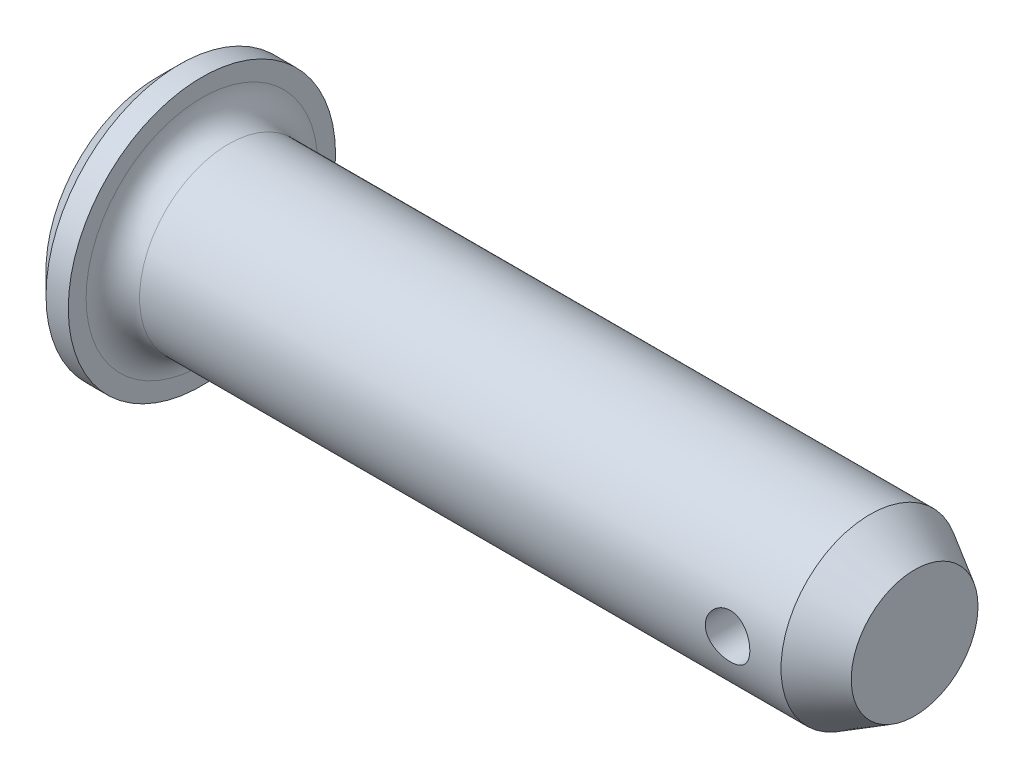
ISO-10303-21;
HEADER;
FILE_DESCRIPTION(('STEP AP214'),'2;1');
FILE_NAME('part.step','',(''),(''),'','','');
FILE_SCHEMA(('AUTOMOTIVE_DESIGN { 1 0 10303 214 1 1 1 1 }'));
ENDSEC;
DATA;
#1=APPLICATION_CONTEXT('core data for automotive mechanical design processes');
#2=APPLICATION_PROTOCOL_DEFINITION('international standard','automotive_design',2000,#1);
#3=PRODUCT_CONTEXT('',#1,'mechanical');
#4=PRODUCT('Part','Part','',(#3));
#5=PRODUCT_RELATED_PRODUCT_CATEGORY('part','',(#4));
#6=PRODUCT_DEFINITION_FORMATION('','',#4);
#7=PRODUCT_DEFINITION_CONTEXT('part definition',#1,'design');
#8=PRODUCT_DEFINITION('design','',#6,#7);
#9=PRODUCT_DEFINITION_SHAPE('','',#8);
#10=(LENGTH_UNIT() NAMED_UNIT(*) SI_UNIT(.MILLI.,.METRE.));
#11=(NAMED_UNIT(*) PLANE_ANGLE_UNIT() SI_UNIT($,.RADIAN.));
#12=(NAMED_UNIT(*) SI_UNIT($,.STERADIAN.) SOLID_ANGLE_UNIT());
#13=UNCERTAINTY_MEASURE_WITH_UNIT(LENGTH_MEASURE(1.E-05),#10,'distance_accuracy_value','');
#14=(GEOMETRIC_REPRESENTATION_CONTEXT(3) GLOBAL_UNCERTAINTY_ASSIGNED_CONTEXT((#13)) GLOBAL_UNIT_ASSIGNED_CONTEXT((#10,
#11,#12)) REPRESENTATION_CONTEXT('',''));
#15=CARTESIAN_POINT('',(0.,0.,0.));
#16=DIRECTION('',(0.,0.,1.));
#17=DIRECTION('',(1.,0.,0.));
#18=AXIS2_PLACEMENT_3D('',#15,#16,#17);
#19=CARTESIAN_POINT('',(0.,0.,0.));
#20=DIRECTION('',(-1.,0.,0.));
#21=DIRECTION('',(0.,0.,1.));
#22=AXIS2_PLACEMENT_3D('',#19,#20,#21);
#23=PLANE('',#22);
#24=CARTESIAN_POINT('',(0.,0.,0.));
#25=DIRECTION('',(1.,0.,0.));
#26=DIRECTION('',(0.,0.,-1.));
#27=AXIS2_PLACEMENT_3D('',#24,#25,#26);
#28=CIRCLE('',#27,2.5);
#29=CARTESIAN_POINT('',(0.,0.,-2.5));
#30=VERTEX_POINT('',#29);
#31=EDGE_CURVE('E61',#30,#30,#28,.T.);
#32=ORIENTED_EDGE('',*,*,#31,.F.);
#33=EDGE_LOOP('',(#32));
#34=FACE_BOUND('',#33,.T.);
#35=ADVANCED_FACE('F38',(#34),#23,.T.);
#36=CARTESIAN_POINT('',(0.5,0.,0.));
#37=DIRECTION('',(1.,0.,0.));
#38=DIRECTION('',(0.,0.,-1.));
#39=AXIS2_PLACEMENT_3D('',#36,#37,#38);
#40=CONICAL_SURFACE('',#39,3.,0.785398163397448);
#41=ORIENTED_EDGE('',*,*,#31,.T.);
#42=EDGE_LOOP('',(#41));
#43=FACE_BOUND('',#42,.T.);
#44=CARTESIAN_POINT('',(0.5,0.,0.));
#45=DIRECTION('',(1.,0.,0.));
#46=DIRECTION('',(0.,0.,-1.));
#47=AXIS2_PLACEMENT_3D('',#44,#45,#46);
#48=CIRCLE('',#47,3.);
#49=CARTESIAN_POINT('',(0.5,0.,-3.));
#50=VERTEX_POINT('',#49);
#51=EDGE_CURVE('E126',#50,#50,#48,.T.);
#52=ORIENTED_EDGE('',*,*,#51,.F.);
#53=EDGE_LOOP('',(#52));
#54=FACE_BOUND('',#53,.T.);
#55=ADVANCED_FACE('F93',(#43,#54),#40,.T.);
#56=CARTESIAN_POINT('',(0.,0.,0.));
#57=DIRECTION('',(1.,0.,0.));
#58=DIRECTION('',(0.,0.,-1.));
#59=AXIS2_PLACEMENT_3D('',#56,#57,#58);
#60=CYLINDRICAL_SURFACE('',#59,3.);
#61=ORIENTED_EDGE('',*,*,#51,.T.);
#62=EDGE_LOOP('',(#61));
#63=FACE_BOUND('',#62,.T.);
#64=CARTESIAN_POINT('',(1.,0.,0.));
#65=DIRECTION('',(1.,0.,0.));
#66=DIRECTION('',(0.,0.,-1.));
#67=AXIS2_PLACEMENT_3D('',#64,#65,#66);
#68=CIRCLE('',#67,3.);
#69=CARTESIAN_POINT('',(1.,0.,-3.));
#70=VERTEX_POINT('',#69);
#71=EDGE_CURVE('E70',#70,#70,#68,.T.);
#72=ORIENTED_EDGE('',*,*,#71,.F.);
#73=EDGE_LOOP('',(#72));
#74=FACE_BOUND('',#73,.T.);
#75=ADVANCED_FACE('F99',(#63,#74),#60,.T.);
#76=CARTESIAN_POINT('',(1.,3.,0.));
#77=DIRECTION('',(1.,0.,0.));
#78=DIRECTION('',(0.,0.,-1.));
#79=AXIS2_PLACEMENT_3D('',#76,#77,#78);
#80=PLANE('',#79);
#81=CARTESIAN_POINT('',(1.,0.,0.));
#82=DIRECTION('',(1.,0.,0.));
#83=DIRECTION('',(0.,0.,-1.));
#84=AXIS2_PLACEMENT_3D('',#81,#82,#83);
#85=CIRCLE('',#84,2.6);
#86=CARTESIAN_POINT('',(1.,0.,-2.6));
#87=VERTEX_POINT('',#86);
#88=EDGE_CURVE('E50',#87,#87,#85,.F.);
#89=ORIENTED_EDGE('',*,*,#88,.T.);
#90=EDGE_LOOP('',(#89));
#91=FACE_BOUND('',#90,.T.);
#92=ORIENTED_EDGE('',*,*,#71,.T.);
#93=EDGE_LOOP('',(#92));
#94=FACE_BOUND('',#93,.T.);
#95=ADVANCED_FACE('F91',(#91,#94),#80,.T.);
#96=CARTESIAN_POINT('',(0.,0.,0.));
#97=DIRECTION('',(1.,0.,0.));
#98=DIRECTION('',(0.,0.,-1.));
#99=AXIS2_PLACEMENT_3D('',#96,#97,#98);
#100=CYLINDRICAL_SURFACE('',#99,2.);
#101=CARTESIAN_POINT('',(16.,0.,0.));
#102=DIRECTION('',(1.,0.,0.));
#103=DIRECTION('',(0.,0.,-1.));
#104=AXIS2_PLACEMENT_3D('',#101,#102,#103);
#105=CIRCLE('',#104,2.);
#106=CARTESIAN_POINT('',(16.,0.,-2.));
#107=VERTEX_POINT('',#106);
#108=EDGE_CURVE('E10',#107,#107,#105,.F.);
#109=ORIENTED_EDGE('',*,*,#108,.T.);
#110=EDGE_LOOP('',(#109));
#111=FACE_BOUND('',#110,.T.);
#112=CARTESIAN_POINT('',(1.6,0.,0.));
#113=DIRECTION('',(1.,0.,0.));
#114=DIRECTION('',(0.,0.,-1.));
#115=AXIS2_PLACEMENT_3D('',#112,#113,#114);
#116=CIRCLE('',#115,2.);
#117=CARTESIAN_POINT('',(1.6,0.,-2.));
#118=VERTEX_POINT('',#117);
#119=EDGE_CURVE('E56',#118,#118,#116,.T.);
#120=ORIENTED_EDGE('',*,*,#119,.T.);
#121=EDGE_LOOP('',(#120));
#122=FACE_BOUND('',#121,.T.);
#123=CARTESIAN_POINT('',(14.3,0.,-2.));
#124=CARTESIAN_POINT('',(14.3000007752461,0.0276253628899104,-1.99999953289338));
#125=CARTESIAN_POINT('',(14.3022971835913,0.0552593859435878,-1.99942192710609));
#126=CARTESIAN_POINT('',(14.311408383769,0.109735441256844,-1.99717371276631));
#127=CARTESIAN_POINT('',(14.3182257365126,0.13657701562358,-1.99550248473323));
#128=CARTESIAN_POINT('',(14.3361464178207,0.188673624060859,-1.99125208777347));
#129=CARTESIAN_POINT('',(14.3472445995718,0.213930521143335,-1.98867400947362));
#130=CARTESIAN_POINT('',(14.3733937966816,0.262224043968142,-1.98288447935864));
#131=CARTESIAN_POINT('',(14.388444945373,0.28526059478292,-1.97967300618017));
#132=CARTESIAN_POINT('',(14.4224002632181,0.328933975766973,-1.97289137863934));
#133=CARTESIAN_POINT('',(14.4413705249864,0.34951856335369,-1.96931569049511));
#134=CARTESIAN_POINT('',(14.482484068303,0.387249642401101,-1.96224540039177));
#135=CARTESIAN_POINT('',(14.5046277076488,0.404395745649712,-1.95875080762783));
#136=CARTESIAN_POINT('',(14.5518650755792,0.435008847599678,-1.9521825856657));
#137=CARTESIAN_POINT('',(14.5769977436035,0.448417405308453,-1.94911598156868));
#138=CARTESIAN_POINT('',(14.6292494705528,0.470798969516843,-1.94383164937408));
#139=CARTESIAN_POINT('',(14.6563682111086,0.479772685146445,-1.94161378557596));
#140=CARTESIAN_POINT('',(14.7112478327342,0.492851612268098,-1.93833492239184));
#141=CARTESIAN_POINT('',(14.7389849653499,0.497050756111114,-1.93725163691809));
#142=CARTESIAN_POINT('',(14.7947895230047,0.500753925022618,-1.9362978751258));
#143=CARTESIAN_POINT('',(14.8228568935662,0.500258713939327,-1.93642720149548));
#144=CARTESIAN_POINT('',(14.8778052692482,0.494662174879761,-1.93786401832206));
#145=CARTESIAN_POINT('',(14.9046985404884,0.489672780063508,-1.93914287667293));
#146=CARTESIAN_POINT('',(14.9572536836371,0.475408062301036,-1.94268903225495));
#147=CARTESIAN_POINT('',(14.9829154676763,0.466132434023142,-1.94495639990232));
#148=CARTESIAN_POINT('',(15.0325793387507,0.443463159312385,-1.95025037968062));
#149=CARTESIAN_POINT('',(15.0565620572632,0.430028889077638,-1.95328442489807));
#150=CARTESIAN_POINT('',(15.1019729032523,0.399452092004985,-1.95976570282129));
#151=CARTESIAN_POINT('',(15.1234005826891,0.382308916269613,-1.96321300778245));
#152=CARTESIAN_POINT('',(15.1637345385648,0.344221141560406,-1.9702529351326));
#153=CARTESIAN_POINT('',(15.1825514966871,0.323182086055287,-1.97384689825991));
#154=CARTESIAN_POINT('',(15.2164070808213,0.278203972501234,-1.98068655192929));
#155=CARTESIAN_POINT('',(15.2314455914212,0.254264825902648,-1.98393223183139));
#156=CARTESIAN_POINT('',(15.2573501954081,0.204038629560464,-1.98972577364728));
#157=CARTESIAN_POINT('',(15.2682017800848,0.177743797736208,-1.99227120042575));
#158=CARTESIAN_POINT('',(15.2853057685699,0.123625336047627,-1.99635972330473));
#159=CARTESIAN_POINT('',(15.2915590521394,0.0958019997168279,-1.99790301113094));
#160=CARTESIAN_POINT('',(15.299152521853,0.0401799901300084,-1.99978499757125));
#161=CARTESIAN_POINT('',(15.3006143420251,0.0123989066627361,-2.00015351169426));
#162=CARTESIAN_POINT('',(15.2989169993148,-0.0430109582671696,-1.9997293493815));
#163=CARTESIAN_POINT('',(15.2957582524003,-0.0706397532148652,-1.99893677747282));
#164=CARTESIAN_POINT('',(15.2850096972029,-0.124538089592164,-1.99629860375786));
#165=CARTESIAN_POINT('',(15.2774862455077,-0.150821706322918,-1.99446878061937));
#166=CARTESIAN_POINT('',(15.2582976386572,-0.201752430817504,-1.98996235544711));
#167=CARTESIAN_POINT('',(15.246632065229,-0.226399373010878,-1.98728566789964));
#168=CARTESIAN_POINT('',(15.2192546237084,-0.273841044809949,-1.98131102642104));
#169=CARTESIAN_POINT('',(15.2034746292011,-0.29659514727861,-1.97800289122311));
#170=CARTESIAN_POINT('',(15.1684033637344,-0.339175537881082,-1.97114836395807));
#171=CARTESIAN_POINT('',(15.1491114867944,-0.35900131965767,-1.96760193083902));
#172=CARTESIAN_POINT('',(15.1069993463852,-0.39566352269091,-1.96056318986924));
#173=CARTESIAN_POINT('',(15.0841040989992,-0.412414622540678,-1.95707434729094));
#174=CARTESIAN_POINT('',(15.0357557885114,-0.4418369196709,-1.95064292792413));
#175=CARTESIAN_POINT('',(15.0103028390134,-0.454508298052646,-1.94770032689009));
#176=CARTESIAN_POINT('',(14.957698092529,-0.475317140203098,-1.94272698244888));
#177=CARTESIAN_POINT('',(14.9305574572187,-0.483481465551356,-1.94069085097302));
#178=CARTESIAN_POINT('',(14.8752301207036,-0.495115219984594,-1.93775581363395));
#179=CARTESIAN_POINT('',(14.8470436496558,-0.49858567582622,-1.93685665906645));
#180=CARTESIAN_POINT('',(14.7912929920483,-0.500679530111332,-1.93631633734652));
#181=CARTESIAN_POINT('',(14.7637341882918,-0.49943929926004,-1.93663977576088));
#182=CARTESIAN_POINT('',(14.7092320371107,-0.492459092770956,-1.93842636335948));
#183=CARTESIAN_POINT('',(14.6822886773288,-0.486719207562257,-1.93988948963952));
#184=CARTESIAN_POINT('',(14.6299305136449,-0.470977106480932,-1.94377086894241));
#185=CARTESIAN_POINT('',(14.6045075649199,-0.461000468226793,-1.94618338412103));
#186=CARTESIAN_POINT('',(14.5556782057621,-0.437088304535025,-1.95169251908276));
#187=CARTESIAN_POINT('',(14.5322720756044,-0.423152230011397,-1.95478923373591));
#188=CARTESIAN_POINT('',(14.4874817903327,-0.391289249545713,-1.96141878087837));
#189=CARTESIAN_POINT('',(14.4661663088587,-0.373267720970753,-1.96496088277252));
#190=CARTESIAN_POINT('',(14.4268176517349,-0.333929790396579,-1.97202675748762));
#191=CARTESIAN_POINT('',(14.408785256629,-0.312612607087049,-1.97555052575687));
#192=CARTESIAN_POINT('',(14.3761962304785,-0.266822528900864,-1.98225885215888));
#193=CARTESIAN_POINT('',(14.3617084621095,-0.242299474105463,-1.98543611121956));
#194=CARTESIAN_POINT('',(14.3370841790198,-0.191088686503492,-1.99101641658373));
#195=CARTESIAN_POINT('',(14.3269445464505,-0.16440252114558,-1.99342001733261));
#196=CARTESIAN_POINT('',(14.3128093898901,-0.114803417747824,-1.99682686521847));
#197=CARTESIAN_POINT('',(14.3080162523155,-0.0921267236360228,-1.9980086168423));
#198=CARTESIAN_POINT('',(14.301611352126,-0.0463020238454277,-1.99959535077316));
#199=CARTESIAN_POINT('',(14.2999993502316,-0.0231540537475387,-2.00000039150298));
#200=CARTESIAN_POINT('',(14.3,0.,-2.));
#201=B_SPLINE_CURVE_WITH_KNOTS('',3,(#123,#124,#125,#126,#127,#128,#129,#130,#131,#132,#133,
#134,#135,#136,#137,#138,#139,#140,#141,#142,#143,#144,#145,#146,#147,#148,#149,#150,#151,#152,
#153,#154,#155,#156,#157,#158,#159,#160,#161,#162,#163,#164,#165,#166,#167,#168,#169,#170,#171,
#172,#173,#174,#175,#176,#177,#178,#179,#180,#181,#182,#183,#184,#185,#186,#187,#188,#189,#190,
#191,#192,#193,#194,#195,#196,#197,#198,#199,#200),.UNSPECIFIED.,.T.,.F.,(4,2,2,2,2,2,2,2,2,2,2,
2,2,2,2,2,2,2,2,2,2,2,2,2,2,2,2,2,2,2,2,2,2,2,2,2,2,2,4),(0.,0.08279123749063,0.165629412587966,
0.248368300762035,0.331109980056443,0.415381451457129,0.499662431933539,0.585195491819357,
0.670714870564561,0.75452098366477,0.838313460375658,0.920074990023394,1.0018423448868,
1.08443509291293,1.16704230278721,1.25200500323007,1.33697029852749,1.42222743003038,
1.50746824562881,1.59052769649759,1.67357967037581,1.75540091504679,1.83723042440764,
1.92051195855117,2.0038078766934,2.08914836401492,2.17448506249836,2.25930751538012,
2.34411141084136,2.42647926799538,2.50884546985345,2.59072133519816,2.67260856045634,
2.75663192136637,2.84067523256806,2.92624061833196,3.01174454607117,3.08114080980717,
3.1505318534768),.UNSPECIFIED.);
#202=CARTESIAN_POINT('',(14.3,0.,-2.));
#203=VERTEX_POINT('',#202);
#204=EDGE_CURVE('E62',#203,#203,#201,.T.);
#205=ORIENTED_EDGE('',*,*,#204,.F.);
#206=EDGE_LOOP('',(#205));
#207=FACE_BOUND('',#206,.T.);
#208=CARTESIAN_POINT('',(15.3,0.,2.));
#209=CARTESIAN_POINT('',(15.299999224754,0.0276253628899103,1.99999953289338));
#210=CARTESIAN_POINT('',(15.2977028164087,0.0552593859435876,1.99942192710609));
#211=CARTESIAN_POINT('',(15.288591616231,0.109735441256844,1.99717371276631));
#212=CARTESIAN_POINT('',(15.2817742634874,0.13657701562358,1.99550248473323));
#213=CARTESIAN_POINT('',(15.2638535821793,0.188673624060859,1.99125208777347));
#214=CARTESIAN_POINT('',(15.2527554004282,0.213930521143335,1.98867400947362));
#215=CARTESIAN_POINT('',(15.2266062033184,0.262224043968142,1.98288447935864));
#216=CARTESIAN_POINT('',(15.211555054627,0.28526059478292,1.97967300618017));
#217=CARTESIAN_POINT('',(15.1775997367819,0.328933975766973,1.97289137863934));
#218=CARTESIAN_POINT('',(15.1586294750136,0.34951856335369,1.96931569049511));
#219=CARTESIAN_POINT('',(15.117515931697,0.387249642401101,1.96224540039177));
#220=CARTESIAN_POINT('',(15.0953722923512,0.404395745649712,1.95875080762783));
#221=CARTESIAN_POINT('',(15.0481349244209,0.435008847599677,1.9521825856657));
#222=CARTESIAN_POINT('',(15.0230022563965,0.448417405308452,1.94911598156868));
#223=CARTESIAN_POINT('',(14.9707505294472,0.470798969516843,1.94383164937408));
#224=CARTESIAN_POINT('',(14.9436317888914,0.479772685146445,1.94161378557596));
#225=CARTESIAN_POINT('',(14.8887521672659,0.492851612268097,1.93833492239184));
#226=CARTESIAN_POINT('',(14.8610150346501,0.497050756111113,1.93725163691809));
#227=CARTESIAN_POINT('',(14.8052104769953,0.500753925022618,1.9362978751258));
#228=CARTESIAN_POINT('',(14.7771431064338,0.500258713939327,1.93642720149548));
#229=CARTESIAN_POINT('',(14.7221947307518,0.494662174879761,1.93786401832206));
#230=CARTESIAN_POINT('',(14.6953014595116,0.489672780063508,1.93914287667293));
#231=CARTESIAN_POINT('',(14.6427463163629,0.475408062301036,1.94268903225495));
#232=CARTESIAN_POINT('',(14.6170845323237,0.466132434023142,1.94495639990232));
#233=CARTESIAN_POINT('',(14.5674206612493,0.443463159312386,1.95025037968062));
#234=CARTESIAN_POINT('',(14.5434379427368,0.430028889077638,1.95328442489807));
#235=CARTESIAN_POINT('',(14.4980270967477,0.399452092004986,1.95976570282129));
#236=CARTESIAN_POINT('',(14.4765994173109,0.382308916269614,1.96321300778245));
#237=CARTESIAN_POINT('',(14.4362654614352,0.344221141560406,1.9702529351326));
#238=CARTESIAN_POINT('',(14.4174485033129,0.323182086055287,1.97384689825991));
#239=CARTESIAN_POINT('',(14.3835929191787,0.278203972501234,1.98068655192929));
#240=CARTESIAN_POINT('',(14.3685544085788,0.254264825902648,1.98393223183139));
#241=CARTESIAN_POINT('',(14.3426498045919,0.204038629560464,1.98972577364728));
#242=CARTESIAN_POINT('',(14.3317982199152,0.177743797736208,1.99227120042575));
#243=CARTESIAN_POINT('',(14.3146942314301,0.123625336047627,1.99635972330473));
#244=CARTESIAN_POINT('',(14.3084409478606,0.0958019997168279,1.99790301113094));
#245=CARTESIAN_POINT('',(14.3008474781471,0.0401799901300084,1.99978499757125));
#246=CARTESIAN_POINT('',(14.2993856579749,0.0123989066627361,2.00015351169426));
#247=CARTESIAN_POINT('',(14.3010830006852,-0.0430109582671696,1.9997293493815));
#248=CARTESIAN_POINT('',(14.3042417475997,-0.0706397532148652,1.99893677747282));
#249=CARTESIAN_POINT('',(14.3149903027971,-0.124538089592164,1.99629860375786));
#250=CARTESIAN_POINT('',(14.3225137544923,-0.150821706322918,1.99446878061937));
#251=CARTESIAN_POINT('',(14.3417023613428,-0.201752430817504,1.98996235544711));
#252=CARTESIAN_POINT('',(14.3533679347711,-0.226399373010878,1.98728566789964));
#253=CARTESIAN_POINT('',(14.3807453762916,-0.273841044809949,1.98131102642104));
#254=CARTESIAN_POINT('',(14.3965253707989,-0.29659514727861,1.97800289122311));
#255=CARTESIAN_POINT('',(14.4315966362657,-0.339175537881082,1.97114836395807));
#256=CARTESIAN_POINT('',(14.4508885132056,-0.35900131965767,1.96760193083902));
#257=CARTESIAN_POINT('',(14.4930006536148,-0.39566352269091,1.96056318986924));
#258=CARTESIAN_POINT('',(14.5158959010008,-0.412414622540678,1.95707434729094));
#259=CARTESIAN_POINT('',(14.5642442114886,-0.4418369196709,1.95064292792413));
#260=CARTESIAN_POINT('',(14.5896971609866,-0.454508298052646,1.94770032689009));
#261=CARTESIAN_POINT('',(14.642301907471,-0.475317140203098,1.94272698244888));
#262=CARTESIAN_POINT('',(14.6694425427813,-0.483481465551356,1.94069085097302));
#263=CARTESIAN_POINT('',(14.7247698792964,-0.495115219984594,1.93775581363395));
#264=CARTESIAN_POINT('',(14.7529563503442,-0.49858567582622,1.93685665906645));
#265=CARTESIAN_POINT('',(14.8087070079517,-0.500679530111332,1.93631633734652));
#266=CARTESIAN_POINT('',(14.8362658117082,-0.49943929926004,1.93663977576088));
#267=CARTESIAN_POINT('',(14.8907679628893,-0.492459092770956,1.93842636335948));
#268=CARTESIAN_POINT('',(14.9177113226712,-0.486719207562257,1.93988948963952));
#269=CARTESIAN_POINT('',(14.9700694863551,-0.470977106480932,1.94377086894241));
#270=CARTESIAN_POINT('',(14.9954924350801,-0.461000468226793,1.94618338412103));
#271=CARTESIAN_POINT('',(15.0443217942379,-0.437088304535025,1.95169251908276));
#272=CARTESIAN_POINT('',(15.0677279243956,-0.423152230011397,1.95478923373591));
#273=CARTESIAN_POINT('',(15.1125182096673,-0.391289249545713,1.96141878087837));
#274=CARTESIAN_POINT('',(15.1338336911413,-0.373267720970753,1.96496088277252));
#275=CARTESIAN_POINT('',(15.1731823482651,-0.333929790396579,1.97202675748762));
#276=CARTESIAN_POINT('',(15.191214743371,-0.312612607087049,1.97555052575687));
#277=CARTESIAN_POINT('',(15.2238037695215,-0.266822528900864,1.98225885215888));
#278=CARTESIAN_POINT('',(15.2382915378905,-0.242299474105463,1.98543611121956));
#279=CARTESIAN_POINT('',(15.2629158209802,-0.191088686503492,1.99101641658373));
#280=CARTESIAN_POINT('',(15.2730554535495,-0.16440252114558,1.99342001733261));
#281=CARTESIAN_POINT('',(15.2871906101099,-0.114803417747824,1.99682686521847));
#282=CARTESIAN_POINT('',(15.2919837476845,-0.0921267236360228,1.9980086168423));
#283=CARTESIAN_POINT('',(15.298388647874,-0.0463020238454277,1.99959535077316));
#284=CARTESIAN_POINT('',(15.3000006497684,-0.0231540537475387,2.00000039150298));
#285=CARTESIAN_POINT('',(15.3,0.,2.));
#286=B_SPLINE_CURVE_WITH_KNOTS('',3,(#208,#209,#210,#211,#212,#213,#214,#215,#216,#217,#218,
#219,#220,#221,#222,#223,#224,#225,#226,#227,#228,#229,#230,#231,#232,#233,#234,#235,#236,#237,
#238,#239,#240,#241,#242,#243,#244,#245,#246,#247,#248,#249,#250,#251,#252,#253,#254,#255,#256,
#257,#258,#259,#260,#261,#262,#263,#264,#265,#266,#267,#268,#269,#270,#271,#272,#273,#274,#275,
#276,#277,#278,#279,#280,#281,#282,#283,#284,#285),.UNSPECIFIED.,.T.,.F.,(4,2,2,2,2,2,2,2,2,2,2,
2,2,2,2,2,2,2,2,2,2,2,2,2,2,2,2,2,2,2,2,2,2,2,2,2,2,2,4),(0.,0.0827912374906297,
0.165629412587966,0.248368300762035,0.331109980056443,0.415381451457129,0.499662431933539,
0.585195491819355,0.670714870564561,0.754520983664769,0.838313460375658,0.920074990023394,
1.0018423448868,1.08443509291293,1.16704230278721,1.25200500323007,1.33697029852749,
1.42222743003038,1.50746824562881,1.59052769649759,1.67357967037581,1.75540091504679,
1.83723042440764,1.92051195855117,2.0038078766934,2.08914836401492,2.17448506249836,
2.25930751538012,2.34411141084136,2.42647926799538,2.50884546985345,2.59072133519816,
2.67260856045634,2.75663192136637,2.84067523256806,2.92624061833196,3.01174454607117,
3.08114080980717,3.1505318534768),.UNSPECIFIED.);
#287=CARTESIAN_POINT('',(15.3,0.,2.));
#288=VERTEX_POINT('',#287);
#289=EDGE_CURVE('E71',#288,#288,#286,.T.);
#290=ORIENTED_EDGE('',*,*,#289,.F.);
#291=EDGE_LOOP('',(#290));
#292=FACE_BOUND('',#291,.T.);
#293=ADVANCED_FACE('F76',(#111,#122,#207,#292),#100,.T.);
#294=CARTESIAN_POINT('',(17.,2.,0.));
#295=DIRECTION('',(1.,0.,0.));
#296=DIRECTION('',(0.,0.,-1.));
#297=AXIS2_PLACEMENT_3D('',#294,#295,#296);
#298=PLANE('',#297);
#299=CARTESIAN_POINT('',(17.,0.,0.));
#300=DIRECTION('',(1.,0.,0.));
#301=DIRECTION('',(0.,0.,-1.));
#302=AXIS2_PLACEMENT_3D('',#299,#300,#301);
#303=CIRCLE('',#302,1.42264973081038);
#304=CARTESIAN_POINT('',(17.,0.,-1.42264973081038));
#305=VERTEX_POINT('',#304);
#306=EDGE_CURVE('E45',#305,#305,#303,.T.);
#307=ORIENTED_EDGE('',*,*,#306,.T.);
#308=EDGE_LOOP('',(#307));
#309=FACE_BOUND('',#308,.T.);
#310=ADVANCED_FACE('F84',(#309),#298,.T.);
#311=CARTESIAN_POINT('',(14.8,0.,-3.));
#312=DIRECTION('',(0.,0.,1.));
#313=DIRECTION('',(1.,0.,0.));
#314=AXIS2_PLACEMENT_3D('',#311,#312,#313);
#315=CYLINDRICAL_SURFACE('',#314,0.500000000000001);
#316=ORIENTED_EDGE('',*,*,#204,.T.);
#317=EDGE_LOOP('',(#316));
#318=FACE_BOUND('',#317,.T.);
#319=ORIENTED_EDGE('',*,*,#289,.T.);
#320=EDGE_LOOP('',(#319));
#321=FACE_BOUND('',#320,.T.);
#322=ADVANCED_FACE('F80',(#318,#321),#315,.F.);
#323=CARTESIAN_POINT('',(1.6,0.,0.));
#324=DIRECTION('',(1.,0.,0.));
#325=DIRECTION('',(0.,0.,-1.));
#326=AXIS2_PLACEMENT_3D('',#323,#324,#325);
#327=TOROIDAL_SURFACE('',#326,2.6,0.6);
#328=ORIENTED_EDGE('',*,*,#88,.F.);
#329=EDGE_LOOP('',(#328));
#330=FACE_BOUND('',#329,.T.);
#331=ORIENTED_EDGE('',*,*,#119,.F.);
#332=EDGE_LOOP('',(#331));
#333=FACE_BOUND('',#332,.T.);
#334=ADVANCED_FACE('F83',(#330,#333),#327,.F.);
#335=CARTESIAN_POINT('',(17.,0.,0.));
#336=DIRECTION('',(-1.,0.,0.));
#337=DIRECTION('',(0.,0.,1.));
#338=AXIS2_PLACEMENT_3D('',#335,#336,#337);
#339=CONICAL_SURFACE('',#338,1.42264973081038,0.523598775598296);
#340=ORIENTED_EDGE('',*,*,#108,.F.);
#341=EDGE_LOOP('',(#340));
#342=FACE_BOUND('',#341,.T.);
#343=ORIENTED_EDGE('',*,*,#306,.F.);
#344=EDGE_LOOP('',(#343));
#345=FACE_BOUND('',#344,.T.);
#346=ADVANCED_FACE('F40',(#342,#345),#339,.T.);
#347=CLOSED_SHELL('',(#35,#55,#75,#95,#293,#310,#322,#334,#346));
#348=MANIFOLD_SOLID_BREP('B2',#347);
#349=ADVANCED_BREP_SHAPE_REPRESENTATION('',(#18,#348),#14);
#350=SHAPE_DEFINITION_REPRESENTATION(#9,#349);
ENDSEC;
END-ISO-10303-21;
